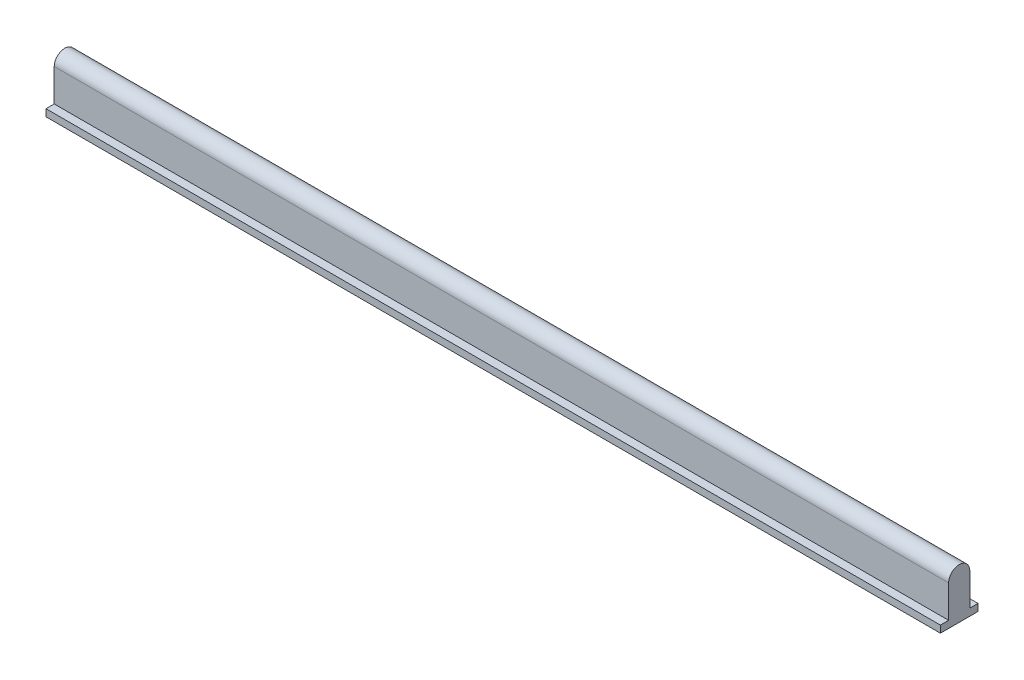
ISO-10303-21;
HEADER;
FILE_DESCRIPTION(('STEP AP214'),'2;1');
FILE_NAME('part.step','',(''),(''),'','','');
FILE_SCHEMA(('AUTOMOTIVE_DESIGN { 1 0 10303 214 1 1 1 1 }'));
ENDSEC;
DATA;
#1=APPLICATION_CONTEXT('core data for automotive mechanical design processes');
#2=APPLICATION_PROTOCOL_DEFINITION('international standard','automotive_design',2000,#1);
#3=PRODUCT_CONTEXT('',#1,'mechanical');
#4=PRODUCT('Part','Part','',(#3));
#5=PRODUCT_RELATED_PRODUCT_CATEGORY('part','',(#4));
#6=PRODUCT_DEFINITION_FORMATION('','',#4);
#7=PRODUCT_DEFINITION_CONTEXT('part definition',#1,'design');
#8=PRODUCT_DEFINITION('design','',#6,#7);
#9=PRODUCT_DEFINITION_SHAPE('','',#8);
#10=(LENGTH_UNIT() NAMED_UNIT(*) SI_UNIT(.MILLI.,.METRE.));
#11=(NAMED_UNIT(*) PLANE_ANGLE_UNIT() SI_UNIT($,.RADIAN.));
#12=(NAMED_UNIT(*) SI_UNIT($,.STERADIAN.) SOLID_ANGLE_UNIT());
#13=UNCERTAINTY_MEASURE_WITH_UNIT(LENGTH_MEASURE(1.E-05),#10,'distance_accuracy_value','');
#14=(GEOMETRIC_REPRESENTATION_CONTEXT(3) GLOBAL_UNCERTAINTY_ASSIGNED_CONTEXT((#13)) GLOBAL_UNIT_ASSIGNED_CONTEXT((#10,
#11,#12)) REPRESENTATION_CONTEXT('',''));
#15=CARTESIAN_POINT('',(0.,0.,0.));
#16=DIRECTION('',(0.,0.,1.));
#17=DIRECTION('',(1.,0.,0.));
#18=AXIS2_PLACEMENT_3D('',#15,#16,#17);
#19=CARTESIAN_POINT('',(507.8,-1.63636403305826,0.));
#20=DIRECTION('',(-1.,0.,0.));
#21=DIRECTION('',(0.,0.,1.));
#22=AXIS2_PLACEMENT_3D('',#19,#20,#21);
#23=CYLINDRICAL_SURFACE('',#22,6.);
#24=CARTESIAN_POINT('',(0.,-1.63636403305826,0.));
#25=DIRECTION('',(1.,0.,0.));
#26=DIRECTION('',(0.,0.,-1.));
#27=AXIS2_PLACEMENT_3D('',#24,#25,#26);
#28=CIRCLE('',#27,6.);
#29=CARTESIAN_POINT('',(0.,-1.63636403305826,-6.));
#30=VERTEX_POINT('',#29);
#31=CARTESIAN_POINT('',(0.,-1.63636403305826,6.));
#32=VERTEX_POINT('',#31);
#33=EDGE_CURVE('E131',#30,#32,#28,.T.);
#34=ORIENTED_EDGE('',*,*,#33,.T.);
#35=DIRECTION('',(-1.,0.,0.));
#36=VECTOR('',#35,1.);
#37=CARTESIAN_POINT('',(507.8,-1.63636403305826,6.));
#38=LINE('',#37,#36);
#39=CARTESIAN_POINT('',(507.8,-1.63636403305826,6.));
#40=VERTEX_POINT('',#39);
#41=EDGE_CURVE('E11',#40,#32,#38,.T.);
#42=ORIENTED_EDGE('',*,*,#41,.F.);
#43=CARTESIAN_POINT('',(507.8,-1.63636403305826,0.));
#44=DIRECTION('',(1.,0.,0.));
#45=DIRECTION('',(0.,0.,-1.));
#46=AXIS2_PLACEMENT_3D('',#43,#44,#45);
#47=CIRCLE('',#46,6.);
#48=CARTESIAN_POINT('',(507.8,-1.63636403305826,-6.));
#49=VERTEX_POINT('',#48);
#50=EDGE_CURVE('E145',#49,#40,#47,.T.);
#51=ORIENTED_EDGE('',*,*,#50,.F.);
#52=DIRECTION('',(-1.,0.,0.));
#53=VECTOR('',#52,1.);
#54=CARTESIAN_POINT('',(507.8,-1.63636403305826,-6.));
#55=LINE('',#54,#53);
#56=EDGE_CURVE('E127',#49,#30,#55,.T.);
#57=ORIENTED_EDGE('',*,*,#56,.T.);
#58=EDGE_LOOP('',(#34,#42,#51,#57));
#59=FACE_BOUND('',#58,.T.);
#60=ADVANCED_FACE('F35',(#59),#23,.T.);
#61=CARTESIAN_POINT('',(507.8,-1.63636403305826,6.));
#62=DIRECTION('',(0.,0.,-1.));
#63=DIRECTION('',(0.,1.,0.));
#64=AXIS2_PLACEMENT_3D('',#61,#62,#63);
#65=PLANE('',#64);
#66=DIRECTION('',(0.,-1.,0.));
#67=VECTOR('',#66,1.);
#68=CARTESIAN_POINT('',(0.,-1.63636403305826,6.));
#69=LINE('',#68,#67);
#70=CARTESIAN_POINT('',(0.,-20.0363640330583,6.));
#71=VERTEX_POINT('',#70);
#72=EDGE_CURVE('E134',#32,#71,#69,.T.);
#73=ORIENTED_EDGE('',*,*,#72,.T.);
#74=DIRECTION('',(-1.,0.,0.));
#75=VECTOR('',#74,1.);
#76=CARTESIAN_POINT('',(507.8,-20.0363640330583,6.));
#77=LINE('',#76,#75);
#78=CARTESIAN_POINT('',(507.8,-20.0363640330583,6.));
#79=VERTEX_POINT('',#78);
#80=EDGE_CURVE('E43',#79,#71,#77,.T.);
#81=ORIENTED_EDGE('',*,*,#80,.F.);
#82=DIRECTION('',(0.,-1.,0.));
#83=VECTOR('',#82,1.);
#84=CARTESIAN_POINT('',(507.8,-1.63636403305826,6.));
#85=LINE('',#84,#83);
#86=EDGE_CURVE('E94',#40,#79,#85,.T.);
#87=ORIENTED_EDGE('',*,*,#86,.F.);
#88=ORIENTED_EDGE('',*,*,#41,.T.);
#89=EDGE_LOOP('',(#73,#81,#87,#88));
#90=FACE_BOUND('',#89,.T.);
#91=ADVANCED_FACE('F180',(#90),#65,.F.);
#92=CARTESIAN_POINT('',(507.8,-20.0363640330583,6.));
#93=DIRECTION('',(0.,-1.,0.));
#94=DIRECTION('',(0.,0.,-1.));
#95=AXIS2_PLACEMENT_3D('',#92,#93,#94);
#96=PLANE('',#95);
#97=DIRECTION('',(0.,0.,1.));
#98=VECTOR('',#97,1.);
#99=CARTESIAN_POINT('',(0.,-20.0363640330583,6.));
#100=LINE('',#99,#98);
#101=CARTESIAN_POINT('',(0.,-20.0363640330583,10.6697217683147));
#102=VERTEX_POINT('',#101);
#103=EDGE_CURVE('E136',#71,#102,#100,.T.);
#104=ORIENTED_EDGE('',*,*,#103,.T.);
#105=DIRECTION('',(-1.,0.,0.));
#106=VECTOR('',#105,1.);
#107=CARTESIAN_POINT('',(507.8,-20.0363640330583,10.6697217683147));
#108=LINE('',#107,#106);
#109=CARTESIAN_POINT('',(507.8,-20.0363640330583,10.6697217683147));
#110=VERTEX_POINT('',#109);
#111=EDGE_CURVE('E152',#110,#102,#108,.T.);
#112=ORIENTED_EDGE('',*,*,#111,.F.);
#113=DIRECTION('',(0.,0.,1.));
#114=VECTOR('',#113,1.);
#115=CARTESIAN_POINT('',(507.8,-20.0363640330583,6.));
#116=LINE('',#115,#114);
#117=EDGE_CURVE('E160',#79,#110,#116,.T.);
#118=ORIENTED_EDGE('',*,*,#117,.F.);
#119=ORIENTED_EDGE('',*,*,#80,.T.);
#120=EDGE_LOOP('',(#104,#112,#118,#119));
#121=FACE_BOUND('',#120,.T.);
#122=ADVANCED_FACE('F158',(#121),#96,.F.);
#123=CARTESIAN_POINT('',(507.8,-20.0363640330583,10.6697217683147));
#124=DIRECTION('',(0.,0.,-1.));
#125=DIRECTION('',(-1.,0.,0.));
#126=AXIS2_PLACEMENT_3D('',#123,#124,#125);
#127=PLANE('',#126);
#128=DIRECTION('',(0.,-1.,0.));
#129=VECTOR('',#128,1.);
#130=CARTESIAN_POINT('',(0.,-20.0363640330583,10.6697217683147));
#131=LINE('',#130,#129);
#132=CARTESIAN_POINT('',(0.,-24.0363640330583,10.6697217683147));
#133=VERTEX_POINT('',#132);
#134=EDGE_CURVE('E138',#102,#133,#131,.T.);
#135=ORIENTED_EDGE('',*,*,#134,.T.);
#136=DIRECTION('',(-1.,0.,0.));
#137=VECTOR('',#136,1.);
#138=CARTESIAN_POINT('',(507.8,-24.0363640330583,10.6697217683147));
#139=LINE('',#138,#137);
#140=CARTESIAN_POINT('',(507.8,-24.0363640330583,10.6697217683147));
#141=VERTEX_POINT('',#140);
#142=EDGE_CURVE('E149',#141,#133,#139,.T.);
#143=ORIENTED_EDGE('',*,*,#142,.F.);
#144=DIRECTION('',(0.,-1.,0.));
#145=VECTOR('',#144,1.);
#146=CARTESIAN_POINT('',(507.8,-20.0363640330583,10.6697217683147));
#147=LINE('',#146,#145);
#148=EDGE_CURVE('E172',#110,#141,#147,.T.);
#149=ORIENTED_EDGE('',*,*,#148,.F.);
#150=ORIENTED_EDGE('',*,*,#111,.T.);
#151=EDGE_LOOP('',(#135,#143,#149,#150));
#152=FACE_BOUND('',#151,.T.);
#153=ADVANCED_FACE('F168',(#152),#127,.F.);
#154=CARTESIAN_POINT('',(507.8,-24.0363640330583,10.6697217683147));
#155=DIRECTION('',(0.,1.,0.));
#156=DIRECTION('',(0.,0.,1.));
#157=AXIS2_PLACEMENT_3D('',#154,#155,#156);
#158=PLANE('',#157);
#159=DIRECTION('',(0.,0.,-1.));
#160=VECTOR('',#159,1.);
#161=CARTESIAN_POINT('',(0.,-24.0363640330583,10.6697217683147));
#162=LINE('',#161,#160);
#163=CARTESIAN_POINT('',(0.,-24.0363640330583,-10.6697217683147));
#164=VERTEX_POINT('',#163);
#165=EDGE_CURVE('E140',#133,#164,#162,.T.);
#166=ORIENTED_EDGE('',*,*,#165,.T.);
#167=DIRECTION('',(-1.,0.,0.));
#168=VECTOR('',#167,1.);
#169=CARTESIAN_POINT('',(507.8,-24.0363640330583,-10.6697217683147));
#170=LINE('',#169,#168);
#171=CARTESIAN_POINT('',(507.8,-24.0363640330583,-10.6697217683147));
#172=VERTEX_POINT('',#171);
#173=EDGE_CURVE('E122',#172,#164,#170,.T.);
#174=ORIENTED_EDGE('',*,*,#173,.F.);
#175=DIRECTION('',(0.,0.,-1.));
#176=VECTOR('',#175,1.);
#177=CARTESIAN_POINT('',(507.8,-24.0363640330583,10.6697217683147));
#178=LINE('',#177,#176);
#179=EDGE_CURVE('E113',#141,#172,#178,.T.);
#180=ORIENTED_EDGE('',*,*,#179,.F.);
#181=ORIENTED_EDGE('',*,*,#142,.T.);
#182=EDGE_LOOP('',(#166,#174,#180,#181));
#183=FACE_BOUND('',#182,.T.);
#184=ADVANCED_FACE('F171',(#183),#158,.F.);
#185=CARTESIAN_POINT('',(507.8,-20.0363640330583,-10.6697217683147));
#186=DIRECTION('',(0.,0.,1.));
#187=DIRECTION('',(1.,0.,0.));
#188=AXIS2_PLACEMENT_3D('',#185,#186,#187);
#189=PLANE('',#188);
#190=DIRECTION('',(0.,1.,0.));
#191=VECTOR('',#190,1.);
#192=CARTESIAN_POINT('',(0.,-20.0363640330583,-10.6697217683147));
#193=LINE('',#192,#191);
#194=CARTESIAN_POINT('',(0.,-20.0363640330583,-10.6697217683147));
#195=VERTEX_POINT('',#194);
#196=EDGE_CURVE('E121',#164,#195,#193,.T.);
#197=ORIENTED_EDGE('',*,*,#196,.T.);
#198=DIRECTION('',(-1.,0.,0.));
#199=VECTOR('',#198,1.);
#200=CARTESIAN_POINT('',(507.8,-20.0363640330583,-10.6697217683147));
#201=LINE('',#200,#199);
#202=CARTESIAN_POINT('',(507.8,-20.0363640330583,-10.6697217683147));
#203=VERTEX_POINT('',#202);
#204=EDGE_CURVE('E118',#203,#195,#201,.T.);
#205=ORIENTED_EDGE('',*,*,#204,.F.);
#206=DIRECTION('',(0.,1.,0.));
#207=VECTOR('',#206,1.);
#208=CARTESIAN_POINT('',(507.8,-20.0363640330583,-10.6697217683147));
#209=LINE('',#208,#207);
#210=EDGE_CURVE('E107',#172,#203,#209,.T.);
#211=ORIENTED_EDGE('',*,*,#210,.F.);
#212=ORIENTED_EDGE('',*,*,#173,.T.);
#213=EDGE_LOOP('',(#197,#205,#211,#212));
#214=FACE_BOUND('',#213,.T.);
#215=ADVANCED_FACE('F119',(#214),#189,.F.);
#216=CARTESIAN_POINT('',(507.8,-20.0363640330583,-6.));
#217=DIRECTION('',(0.,-1.,0.));
#218=DIRECTION('',(0.,0.,-1.));
#219=AXIS2_PLACEMENT_3D('',#216,#217,#218);
#220=PLANE('',#219);
#221=DIRECTION('',(0.,0.,1.));
#222=VECTOR('',#221,1.);
#223=CARTESIAN_POINT('',(0.,-20.0363640330583,-6.));
#224=LINE('',#223,#222);
#225=CARTESIAN_POINT('',(0.,-20.0363640330583,-6.));
#226=VERTEX_POINT('',#225);
#227=EDGE_CURVE('E80',#195,#226,#224,.T.);
#228=ORIENTED_EDGE('',*,*,#227,.T.);
#229=DIRECTION('',(-1.,0.,0.));
#230=VECTOR('',#229,1.);
#231=CARTESIAN_POINT('',(507.8,-20.0363640330583,-6.));
#232=LINE('',#231,#230);
#233=CARTESIAN_POINT('',(507.8,-20.0363640330583,-6.));
#234=VERTEX_POINT('',#233);
#235=EDGE_CURVE('E123',#234,#226,#232,.T.);
#236=ORIENTED_EDGE('',*,*,#235,.F.);
#237=DIRECTION('',(0.,0.,1.));
#238=VECTOR('',#237,1.);
#239=CARTESIAN_POINT('',(507.8,-20.0363640330583,-6.));
#240=LINE('',#239,#238);
#241=EDGE_CURVE('E111',#203,#234,#240,.T.);
#242=ORIENTED_EDGE('',*,*,#241,.F.);
#243=ORIENTED_EDGE('',*,*,#204,.T.);
#244=EDGE_LOOP('',(#228,#236,#242,#243));
#245=FACE_BOUND('',#244,.T.);
#246=ADVANCED_FACE('F125',(#245),#220,.F.);
#247=CARTESIAN_POINT('',(507.8,-1.63636403305826,-6.));
#248=DIRECTION('',(0.,0.,1.));
#249=DIRECTION('',(0.,-1.,0.));
#250=AXIS2_PLACEMENT_3D('',#247,#248,#249);
#251=PLANE('',#250);
#252=DIRECTION('',(0.,1.,0.));
#253=VECTOR('',#252,1.);
#254=CARTESIAN_POINT('',(0.,-1.63636403305826,-6.));
#255=LINE('',#254,#253);
#256=EDGE_CURVE('E86',#226,#30,#255,.T.);
#257=ORIENTED_EDGE('',*,*,#256,.T.);
#258=ORIENTED_EDGE('',*,*,#56,.F.);
#259=DIRECTION('',(0.,1.,0.));
#260=VECTOR('',#259,1.);
#261=CARTESIAN_POINT('',(507.8,-1.63636403305826,-6.));
#262=LINE('',#261,#260);
#263=EDGE_CURVE('E51',#234,#49,#262,.T.);
#264=ORIENTED_EDGE('',*,*,#263,.F.);
#265=ORIENTED_EDGE('',*,*,#235,.T.);
#266=EDGE_LOOP('',(#257,#258,#264,#265));
#267=FACE_BOUND('',#266,.T.);
#268=ADVANCED_FACE('F196',(#267),#251,.F.);
#269=CARTESIAN_POINT('',(507.8,-1.63636403305826,0.));
#270=DIRECTION('',(1.,0.,0.));
#271=DIRECTION('',(0.,0.,-1.));
#272=AXIS2_PLACEMENT_3D('',#269,#270,#271);
#273=PLANE('',#272);
#274=ORIENTED_EDGE('',*,*,#50,.T.);
#275=ORIENTED_EDGE('',*,*,#86,.T.);
#276=ORIENTED_EDGE('',*,*,#117,.T.);
#277=ORIENTED_EDGE('',*,*,#148,.T.);
#278=ORIENTED_EDGE('',*,*,#179,.T.);
#279=ORIENTED_EDGE('',*,*,#210,.T.);
#280=ORIENTED_EDGE('',*,*,#241,.T.);
#281=ORIENTED_EDGE('',*,*,#263,.T.);
#282=EDGE_LOOP('',(#274,#275,#276,#277,#278,#279,#280,#281));
#283=FACE_BOUND('',#282,.T.);
#284=ADVANCED_FACE('F109',(#283),#273,.T.);
#285=CARTESIAN_POINT('',(0.,-1.63636403305826,0.));
#286=DIRECTION('',(1.,0.,0.));
#287=DIRECTION('',(0.,0.,-1.));
#288=AXIS2_PLACEMENT_3D('',#285,#286,#287);
#289=PLANE('',#288);
#290=ORIENTED_EDGE('',*,*,#33,.F.);
#291=ORIENTED_EDGE('',*,*,#256,.F.);
#292=ORIENTED_EDGE('',*,*,#227,.F.);
#293=ORIENTED_EDGE('',*,*,#196,.F.);
#294=ORIENTED_EDGE('',*,*,#165,.F.);
#295=ORIENTED_EDGE('',*,*,#134,.F.);
#296=ORIENTED_EDGE('',*,*,#103,.F.);
#297=ORIENTED_EDGE('',*,*,#72,.F.);
#298=EDGE_LOOP('',(#290,#291,#292,#293,#294,#295,#296,#297));
#299=FACE_BOUND('',#298,.T.);
#300=ADVANCED_FACE('F164',(#299),#289,.F.);
#301=CLOSED_SHELL('',(#60,#91,#122,#153,#184,#215,#246,#268,#284,#300));
#302=MANIFOLD_SOLID_BREP('B2',#301);
#303=ADVANCED_BREP_SHAPE_REPRESENTATION('',(#18,#302),#14);
#304=SHAPE_DEFINITION_REPRESENTATION(#9,#303);
ENDSEC;
END-ISO-10303-21;
